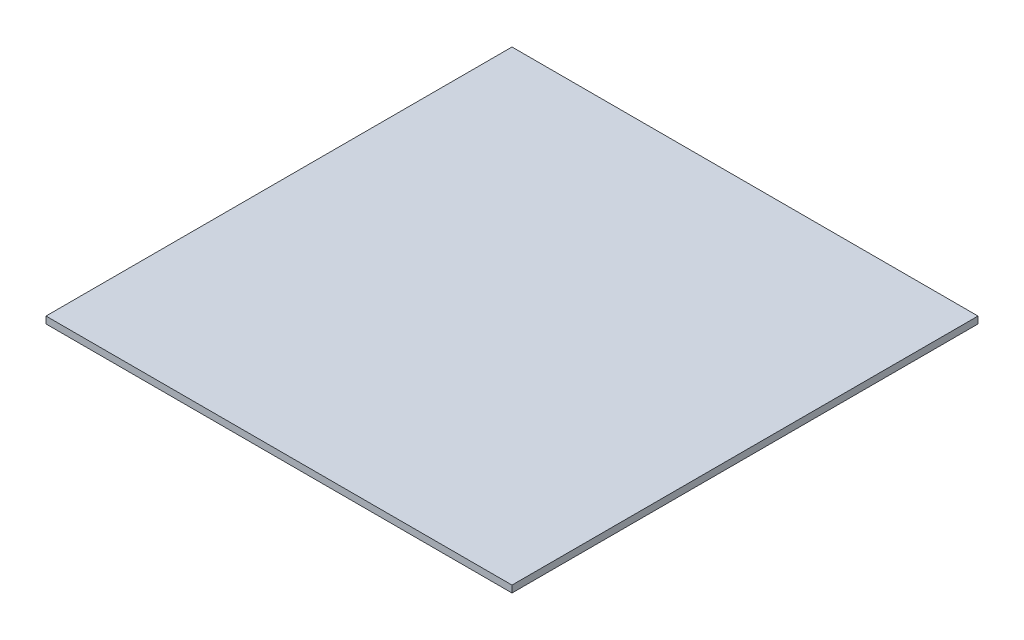
ISO-10303-21;
HEADER;
FILE_DESCRIPTION(('STEP AP214'),'2;1');
FILE_NAME('part.step','',(''),(''),'','','');
FILE_SCHEMA(('AUTOMOTIVE_DESIGN { 1 0 10303 214 1 1 1 1 }'));
ENDSEC;
DATA;
#1=APPLICATION_CONTEXT('core data for automotive mechanical design processes');
#2=APPLICATION_PROTOCOL_DEFINITION('international standard','automotive_design',2000,#1);
#3=PRODUCT_CONTEXT('',#1,'mechanical');
#4=PRODUCT('Part','Part','',(#3));
#5=PRODUCT_RELATED_PRODUCT_CATEGORY('part','',(#4));
#6=PRODUCT_DEFINITION_FORMATION('','',#4);
#7=PRODUCT_DEFINITION_CONTEXT('part definition',#1,'design');
#8=PRODUCT_DEFINITION('design','',#6,#7);
#9=PRODUCT_DEFINITION_SHAPE('','',#8);
#10=(LENGTH_UNIT() NAMED_UNIT(*) SI_UNIT(.MILLI.,.METRE.));
#11=(NAMED_UNIT(*) PLANE_ANGLE_UNIT() SI_UNIT($,.RADIAN.));
#12=(NAMED_UNIT(*) SI_UNIT($,.STERADIAN.) SOLID_ANGLE_UNIT());
#13=UNCERTAINTY_MEASURE_WITH_UNIT(LENGTH_MEASURE(1.E-05),#10,'distance_accuracy_value','');
#14=(GEOMETRIC_REPRESENTATION_CONTEXT(3) GLOBAL_UNCERTAINTY_ASSIGNED_CONTEXT((#13)) GLOBAL_UNIT_ASSIGNED_CONTEXT((#10,
#11,#12)) REPRESENTATION_CONTEXT('',''));
#15=CARTESIAN_POINT('',(0.,0.,0.));
#16=DIRECTION('',(0.,0.,1.));
#17=DIRECTION('',(1.,0.,0.));
#18=AXIS2_PLACEMENT_3D('',#15,#16,#17);
#19=CARTESIAN_POINT('',(101.5,3.,-101.5));
#20=DIRECTION('',(-1.,0.,0.));
#21=DIRECTION('',(0.,0.,1.));
#22=AXIS2_PLACEMENT_3D('',#19,#20,#21);
#23=PLANE('',#22);
#24=DIRECTION('',(0.,0.,-1.));
#25=VECTOR('',#24,1.);
#26=CARTESIAN_POINT('',(101.5,0.,-101.5));
#27=LINE('',#26,#25);
#28=CARTESIAN_POINT('',(101.5,0.,101.5));
#29=VERTEX_POINT('',#28);
#30=CARTESIAN_POINT('',(101.5,0.,-101.5));
#31=VERTEX_POINT('',#30);
#32=EDGE_CURVE('E100',#29,#31,#27,.T.);
#33=ORIENTED_EDGE('',*,*,#32,.T.);
#34=DIRECTION('',(0.,-1.,0.));
#35=VECTOR('',#34,1.);
#36=CARTESIAN_POINT('',(101.5,3.,-101.5));
#37=LINE('',#36,#35);
#38=CARTESIAN_POINT('',(101.5,3.,-101.5));
#39=VERTEX_POINT('',#38);
#40=EDGE_CURVE('E11',#39,#31,#37,.T.);
#41=ORIENTED_EDGE('',*,*,#40,.F.);
#42=DIRECTION('',(0.,0.,-1.));
#43=VECTOR('',#42,1.);
#44=CARTESIAN_POINT('',(101.5,3.,-101.5));
#45=LINE('',#44,#43);
#46=CARTESIAN_POINT('',(101.5,3.,101.5));
#47=VERTEX_POINT('',#46);
#48=EDGE_CURVE('E88',#47,#39,#45,.T.);
#49=ORIENTED_EDGE('',*,*,#48,.F.);
#50=DIRECTION('',(0.,-1.,0.));
#51=VECTOR('',#50,1.);
#52=CARTESIAN_POINT('',(101.5,3.,101.5));
#53=LINE('',#52,#51);
#54=EDGE_CURVE('E96',#47,#29,#53,.T.);
#55=ORIENTED_EDGE('',*,*,#54,.T.);
#56=EDGE_LOOP('',(#33,#41,#49,#55));
#57=FACE_BOUND('',#56,.T.);
#58=ADVANCED_FACE('F37',(#57),#23,.F.);
#59=CARTESIAN_POINT('',(-101.5,3.,-101.5));
#60=DIRECTION('',(0.,0.,1.));
#61=DIRECTION('',(1.,0.,0.));
#62=AXIS2_PLACEMENT_3D('',#59,#60,#61);
#63=PLANE('',#62);
#64=DIRECTION('',(-1.,0.,0.));
#65=VECTOR('',#64,1.);
#66=CARTESIAN_POINT('',(-101.5,0.,-101.5));
#67=LINE('',#66,#65);
#68=CARTESIAN_POINT('',(-101.5,0.,-101.5));
#69=VERTEX_POINT('',#68);
#70=EDGE_CURVE('E92',#31,#69,#67,.T.);
#71=ORIENTED_EDGE('',*,*,#70,.T.);
#72=DIRECTION('',(0.,-1.,0.));
#73=VECTOR('',#72,1.);
#74=CARTESIAN_POINT('',(-101.5,3.,-101.5));
#75=LINE('',#74,#73);
#76=CARTESIAN_POINT('',(-101.5,3.,-101.5));
#77=VERTEX_POINT('',#76);
#78=EDGE_CURVE('E45',#77,#69,#75,.T.);
#79=ORIENTED_EDGE('',*,*,#78,.F.);
#80=DIRECTION('',(-1.,0.,0.));
#81=VECTOR('',#80,1.);
#82=CARTESIAN_POINT('',(-101.5,3.,-101.5));
#83=LINE('',#82,#81);
#84=EDGE_CURVE('E83',#39,#77,#83,.T.);
#85=ORIENTED_EDGE('',*,*,#84,.F.);
#86=ORIENTED_EDGE('',*,*,#40,.T.);
#87=EDGE_LOOP('',(#71,#79,#85,#86));
#88=FACE_BOUND('',#87,.T.);
#89=ADVANCED_FACE('F91',(#88),#63,.F.);
#90=CARTESIAN_POINT('',(-101.5,3.,-101.5));
#91=DIRECTION('',(1.,0.,0.));
#92=DIRECTION('',(0.,0.,-1.));
#93=AXIS2_PLACEMENT_3D('',#90,#91,#92);
#94=PLANE('',#93);
#95=DIRECTION('',(0.,0.,1.));
#96=VECTOR('',#95,1.);
#97=CARTESIAN_POINT('',(-101.5,0.,-101.5));
#98=LINE('',#97,#96);
#99=CARTESIAN_POINT('',(-101.5,0.,101.5));
#100=VERTEX_POINT('',#99);
#101=EDGE_CURVE('E70',#69,#100,#98,.T.);
#102=ORIENTED_EDGE('',*,*,#101,.T.);
#103=DIRECTION('',(0.,-1.,0.));
#104=VECTOR('',#103,1.);
#105=CARTESIAN_POINT('',(-101.5,3.,101.5));
#106=LINE('',#105,#104);
#107=CARTESIAN_POINT('',(-101.5,3.,101.5));
#108=VERTEX_POINT('',#107);
#109=EDGE_CURVE('E93',#108,#100,#106,.T.);
#110=ORIENTED_EDGE('',*,*,#109,.F.);
#111=DIRECTION('',(0.,0.,1.));
#112=VECTOR('',#111,1.);
#113=CARTESIAN_POINT('',(-101.5,3.,-101.5));
#114=LINE('',#113,#112);
#115=EDGE_CURVE('E86',#77,#108,#114,.T.);
#116=ORIENTED_EDGE('',*,*,#115,.F.);
#117=ORIENTED_EDGE('',*,*,#78,.T.);
#118=EDGE_LOOP('',(#102,#110,#116,#117));
#119=FACE_BOUND('',#118,.T.);
#120=ADVANCED_FACE('F94',(#119),#94,.F.);
#121=CARTESIAN_POINT('',(-101.5,3.,101.5));
#122=DIRECTION('',(0.,0.,-1.));
#123=DIRECTION('',(-1.,0.,0.));
#124=AXIS2_PLACEMENT_3D('',#121,#122,#123);
#125=PLANE('',#124);
#126=DIRECTION('',(1.,0.,0.));
#127=VECTOR('',#126,1.);
#128=CARTESIAN_POINT('',(-101.5,0.,101.5));
#129=LINE('',#128,#127);
#130=EDGE_CURVE('E76',#100,#29,#129,.T.);
#131=ORIENTED_EDGE('',*,*,#130,.T.);
#132=ORIENTED_EDGE('',*,*,#54,.F.);
#133=DIRECTION('',(1.,0.,0.));
#134=VECTOR('',#133,1.);
#135=CARTESIAN_POINT('',(-101.5,3.,101.5));
#136=LINE('',#135,#134);
#137=EDGE_CURVE('E53',#108,#47,#136,.T.);
#138=ORIENTED_EDGE('',*,*,#137,.F.);
#139=ORIENTED_EDGE('',*,*,#109,.T.);
#140=EDGE_LOOP('',(#131,#132,#138,#139));
#141=FACE_BOUND('',#140,.T.);
#142=ADVANCED_FACE('F107',(#141),#125,.F.);
#143=CARTESIAN_POINT('',(0.,3.,0.));
#144=DIRECTION('',(0.,1.,0.));
#145=DIRECTION('',(0.,0.,1.));
#146=AXIS2_PLACEMENT_3D('',#143,#144,#145);
#147=PLANE('',#146);
#148=ORIENTED_EDGE('',*,*,#48,.T.);
#149=ORIENTED_EDGE('',*,*,#84,.T.);
#150=ORIENTED_EDGE('',*,*,#115,.T.);
#151=ORIENTED_EDGE('',*,*,#137,.T.);
#152=EDGE_LOOP('',(#148,#149,#150,#151));
#153=FACE_BOUND('',#152,.T.);
#154=ADVANCED_FACE('F84',(#153),#147,.T.);
#155=CARTESIAN_POINT('',(0.,0.,0.));
#156=DIRECTION('',(0.,1.,0.));
#157=DIRECTION('',(0.,0.,1.));
#158=AXIS2_PLACEMENT_3D('',#155,#156,#157);
#159=PLANE('',#158);
#160=ORIENTED_EDGE('',*,*,#32,.F.);
#161=ORIENTED_EDGE('',*,*,#130,.F.);
#162=ORIENTED_EDGE('',*,*,#101,.F.);
#163=ORIENTED_EDGE('',*,*,#70,.F.);
#164=EDGE_LOOP('',(#160,#161,#162,#163));
#165=FACE_BOUND('',#164,.T.);
#166=ADVANCED_FACE('F110',(#165),#159,.F.);
#167=CLOSED_SHELL('',(#58,#89,#120,#142,#154,#166));
#168=MANIFOLD_SOLID_BREP('B2',#167);
#169=ADVANCED_BREP_SHAPE_REPRESENTATION('',(#18,#168),#14);
#170=SHAPE_DEFINITION_REPRESENTATION(#9,#169);
ENDSEC;
END-ISO-10303-21;
